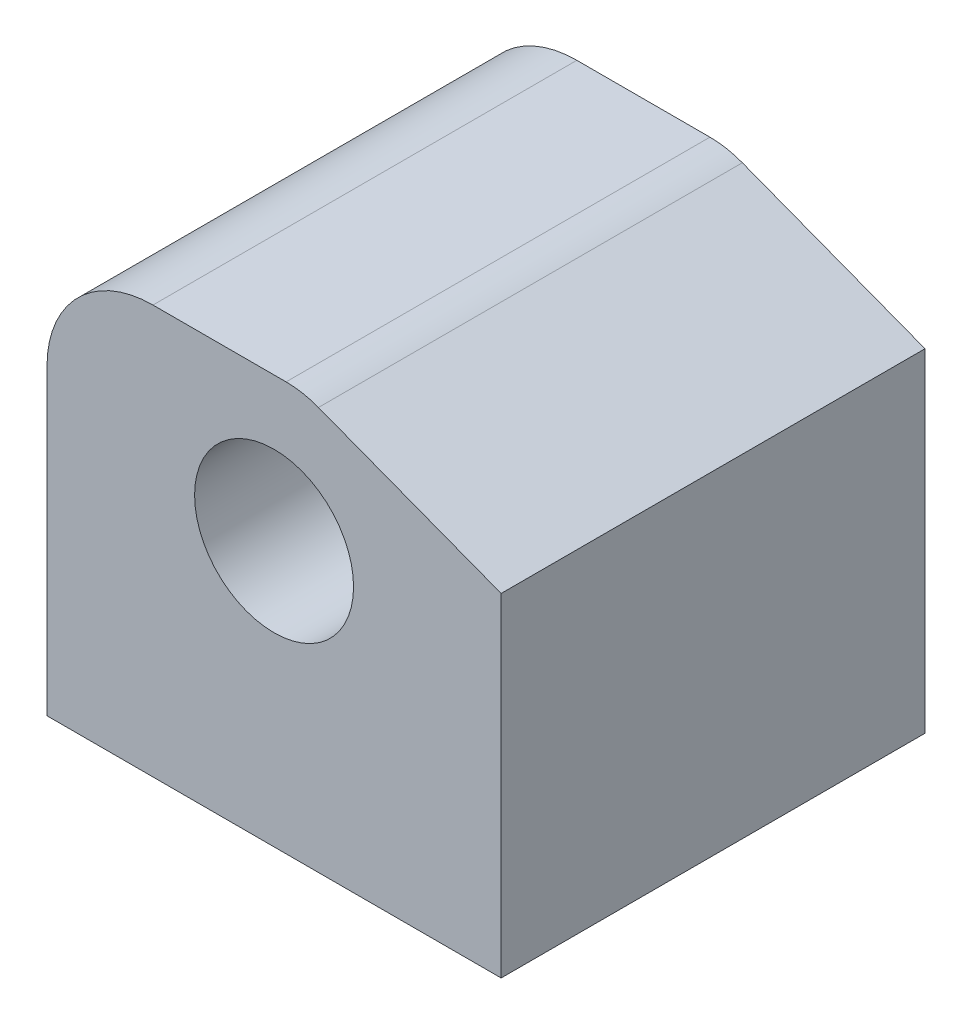
ISO-10303-21;
HEADER;
FILE_DESCRIPTION(('STEP AP214'),'2;1');
FILE_NAME('part.step','',(''),(''),'','','');
FILE_SCHEMA(('AUTOMOTIVE_DESIGN { 1 0 10303 214 1 1 1 1 }'));
ENDSEC;
DATA;
#1=APPLICATION_CONTEXT('core data for automotive mechanical design processes');
#2=APPLICATION_PROTOCOL_DEFINITION('international standard','automotive_design',2000,#1);
#3=PRODUCT_CONTEXT('',#1,'mechanical');
#4=PRODUCT('Part','Part','',(#3));
#5=PRODUCT_RELATED_PRODUCT_CATEGORY('part','',(#4));
#6=PRODUCT_DEFINITION_FORMATION('','',#4);
#7=PRODUCT_DEFINITION_CONTEXT('part definition',#1,'design');
#8=PRODUCT_DEFINITION('design','',#6,#7);
#9=PRODUCT_DEFINITION_SHAPE('','',#8);
#10=(LENGTH_UNIT() NAMED_UNIT(*) SI_UNIT(.MILLI.,.METRE.));
#11=(NAMED_UNIT(*) PLANE_ANGLE_UNIT() SI_UNIT($,.RADIAN.));
#12=(NAMED_UNIT(*) SI_UNIT($,.STERADIAN.) SOLID_ANGLE_UNIT());
#13=UNCERTAINTY_MEASURE_WITH_UNIT(LENGTH_MEASURE(1.E-05),#10,'distance_accuracy_value','');
#14=(GEOMETRIC_REPRESENTATION_CONTEXT(3) GLOBAL_UNCERTAINTY_ASSIGNED_CONTEXT((#13)) GLOBAL_UNIT_ASSIGNED_CONTEXT((#10,
#11,#12)) REPRESENTATION_CONTEXT('',''));
#15=CARTESIAN_POINT('',(0.,0.,0.));
#16=DIRECTION('',(0.,0.,1.));
#17=DIRECTION('',(1.,0.,0.));
#18=AXIS2_PLACEMENT_3D('',#15,#16,#17);
#19=CARTESIAN_POINT('',(0.396938726004659,10.5,0.));
#20=DIRECTION('',(0.,0.,-1.));
#21=DIRECTION('',(-1.,0.,0.));
#22=AXIS2_PLACEMENT_3D('',#19,#20,#21);
#23=CYLINDRICAL_SURFACE('',#22,3.);
#24=DIRECTION('',(0.,0.,-1.));
#25=VECTOR('',#24,1.);
#26=CARTESIAN_POINT('',(0.396938726004659,13.5,0.));
#27=LINE('',#26,#25);
#28=CARTESIAN_POINT('',(0.39693872600466,13.5,7.));
#29=VERTEX_POINT('',#28);
#30=CARTESIAN_POINT('',(0.396938726004657,13.5,-7.));
#31=VERTEX_POINT('',#30);
#32=EDGE_CURVE('E161',#29,#31,#27,.T.);
#33=ORIENTED_EDGE('',*,*,#32,.F.);
#34=CARTESIAN_POINT('',(0.396938726004659,10.5,7.));
#35=DIRECTION('',(0.,0.,-1.));
#36=DIRECTION('',(-1.,0.,0.));
#37=AXIS2_PLACEMENT_3D('',#34,#35,#36);
#38=CIRCLE('',#37,3.);
#39=CARTESIAN_POINT('',(1.4667039050387,13.3027847690692,7.));
#40=VERTEX_POINT('',#39);
#41=EDGE_CURVE('E55',#40,#29,#38,.F.);
#42=ORIENTED_EDGE('',*,*,#41,.F.);
#43=DIRECTION('',(0.,0.,-1.));
#44=VECTOR('',#43,1.);
#45=CARTESIAN_POINT('',(1.4667039050387,13.3027847690692,-8.));
#46=LINE('',#45,#44);
#47=CARTESIAN_POINT('',(1.4667039050387,13.3027847690692,-7.));
#48=VERTEX_POINT('',#47);
#49=EDGE_CURVE('E109',#48,#40,#46,.F.);
#50=ORIENTED_EDGE('',*,*,#49,.F.);
#51=CARTESIAN_POINT('',(0.396938726004659,10.5,-7.));
#52=DIRECTION('',(0.,0.,1.));
#53=DIRECTION('',(1.,0.,0.));
#54=AXIS2_PLACEMENT_3D('',#51,#52,#53);
#55=CIRCLE('',#54,3.);
#56=EDGE_CURVE('E11',#31,#48,#55,.F.);
#57=ORIENTED_EDGE('',*,*,#56,.F.);
#58=EDGE_LOOP('',(#33,#42,#50,#57));
#59=FACE_BOUND('',#58,.T.);
#60=ADVANCED_FACE('F47',(#59),#23,.T.);
#61=CARTESIAN_POINT('',(-4.,10.,0.));
#62=DIRECTION('',(0.,0.,1.));
#63=DIRECTION('',(1.,0.,0.));
#64=AXIS2_PLACEMENT_3D('',#61,#62,#63);
#65=CYLINDRICAL_SURFACE('',#64,3.5);
#66=DIRECTION('',(0.,0.,1.));
#67=VECTOR('',#66,1.);
#68=CARTESIAN_POINT('',(-4.,13.5,0.));
#69=LINE('',#68,#67);
#70=CARTESIAN_POINT('',(-4.,13.5,-7.));
#71=VERTEX_POINT('',#70);
#72=CARTESIAN_POINT('',(-4.,13.5,7.));
#73=VERTEX_POINT('',#72);
#74=EDGE_CURVE('E146',#71,#73,#69,.T.);
#75=ORIENTED_EDGE('',*,*,#74,.F.);
#76=CARTESIAN_POINT('',(-4.,10.,-7.));
#77=DIRECTION('',(0.,0.,1.));
#78=DIRECTION('',(1.,0.,0.));
#79=AXIS2_PLACEMENT_3D('',#76,#77,#78);
#80=CIRCLE('',#79,3.5);
#81=CARTESIAN_POINT('',(-7.5,10.,-7.));
#82=VERTEX_POINT('',#81);
#83=EDGE_CURVE('E154',#82,#71,#80,.F.);
#84=ORIENTED_EDGE('',*,*,#83,.F.);
#85=DIRECTION('',(0.,0.,1.));
#86=VECTOR('',#85,1.);
#87=CARTESIAN_POINT('',(-7.5,10.,7.));
#88=LINE('',#87,#86);
#89=CARTESIAN_POINT('',(-7.5,10.,7.));
#90=VERTEX_POINT('',#89);
#91=EDGE_CURVE('E150',#90,#82,#88,.F.);
#92=ORIENTED_EDGE('',*,*,#91,.F.);
#93=CARTESIAN_POINT('',(-4.,10.,7.));
#94=DIRECTION('',(0.,0.,-1.));
#95=DIRECTION('',(-1.,0.,0.));
#96=AXIS2_PLACEMENT_3D('',#93,#94,#95);
#97=CIRCLE('',#96,3.5);
#98=EDGE_CURVE('E158',#73,#90,#97,.F.);
#99=ORIENTED_EDGE('',*,*,#98,.F.);
#100=EDGE_LOOP('',(#75,#84,#92,#99));
#101=FACE_BOUND('',#100,.T.);
#102=ADVANCED_FACE('F172',(#101),#65,.T.);
#103=CARTESIAN_POINT('',(7.5,13.5,7.));
#104=DIRECTION('',(-1.,0.,0.));
#105=DIRECTION('',(0.,0.,1.));
#106=AXIS2_PLACEMENT_3D('',#103,#104,#105);
#107=PLANE('',#106);
#108=DIRECTION('',(0.,-1.,0.));
#109=VECTOR('',#108,1.);
#110=CARTESIAN_POINT('',(7.5,13.5,-7.));
#111=LINE('',#110,#109);
#112=CARTESIAN_POINT('',(7.5,11.,-7.));
#113=VERTEX_POINT('',#112);
#114=CARTESIAN_POINT('',(7.5,0.,-7.));
#115=VERTEX_POINT('',#114);
#116=EDGE_CURVE('E120',#113,#115,#111,.T.);
#117=ORIENTED_EDGE('',*,*,#116,.F.);
#118=DIRECTION('',(0.,0.,1.));
#119=VECTOR('',#118,1.);
#120=CARTESIAN_POINT('',(7.5,11.,-8.));
#121=LINE('',#120,#119);
#122=CARTESIAN_POINT('',(7.5,11.,7.));
#123=VERTEX_POINT('',#122);
#124=EDGE_CURVE('E107',#113,#123,#121,.T.);
#125=ORIENTED_EDGE('',*,*,#124,.T.);
#126=DIRECTION('',(0.,-1.,0.));
#127=VECTOR('',#126,1.);
#128=CARTESIAN_POINT('',(7.5,13.5,7.));
#129=LINE('',#128,#127);
#130=CARTESIAN_POINT('',(7.5,0.,7.));
#131=VERTEX_POINT('',#130);
#132=EDGE_CURVE('E118',#123,#131,#129,.T.);
#133=ORIENTED_EDGE('',*,*,#132,.T.);
#134=DIRECTION('',(0.,0.,-1.));
#135=VECTOR('',#134,1.);
#136=CARTESIAN_POINT('',(7.5,0.,7.));
#137=LINE('',#136,#135);
#138=EDGE_CURVE('E187',#131,#115,#137,.T.);
#139=ORIENTED_EDGE('',*,*,#138,.T.);
#140=EDGE_LOOP('',(#117,#125,#133,#139));
#141=FACE_BOUND('',#140,.T.);
#142=ADVANCED_FACE('F116',(#141),#107,.F.);
#143=CARTESIAN_POINT('',(-7.5,13.5,-7.));
#144=DIRECTION('',(0.,0.,1.));
#145=DIRECTION('',(1.,0.,0.));
#146=AXIS2_PLACEMENT_3D('',#143,#144,#145);
#147=PLANE('',#146);
#148=CARTESIAN_POINT('',(0.,8.75,-7.));
#149=DIRECTION('',(0.,0.,1.));
#150=DIRECTION('',(1.,0.,0.));
#151=AXIS2_PLACEMENT_3D('',#148,#149,#150);
#152=CIRCLE('',#151,2.625);
#153=CARTESIAN_POINT('',(2.625,8.75,-7.));
#154=VERTEX_POINT('',#153);
#155=EDGE_CURVE('E192',#154,#154,#152,.T.);
#156=ORIENTED_EDGE('',*,*,#155,.T.);
#157=EDGE_LOOP('',(#156));
#158=FACE_BOUND('',#157,.T.);
#159=DIRECTION('',(-1.,0.,0.));
#160=VECTOR('',#159,1.);
#161=CARTESIAN_POINT('',(-7.5,13.5,-7.));
#162=LINE('',#161,#160);
#163=EDGE_CURVE('E137',#31,#71,#162,.T.);
#164=ORIENTED_EDGE('',*,*,#163,.F.);
#165=ORIENTED_EDGE('',*,*,#56,.T.);
#166=DIRECTION('',(0.934261589689732,-0.356588393011348,0.));
#167=VECTOR('',#166,1.);
#168=CARTESIAN_POINT('',(-6.42553786684299,16.3150907888714,-7.));
#169=LINE('',#168,#167);
#170=EDGE_CURVE('E122',#48,#113,#169,.T.);
#171=ORIENTED_EDGE('',*,*,#170,.T.);
#172=ORIENTED_EDGE('',*,*,#116,.T.);
#173=DIRECTION('',(-1.,0.,0.));
#174=VECTOR('',#173,1.);
#175=CARTESIAN_POINT('',(-7.5,0.,-7.));
#176=LINE('',#175,#174);
#177=CARTESIAN_POINT('',(-7.5,0.,-7.));
#178=VERTEX_POINT('',#177);
#179=EDGE_CURVE('E185',#115,#178,#176,.T.);
#180=ORIENTED_EDGE('',*,*,#179,.T.);
#181=DIRECTION('',(0.,-1.,0.));
#182=VECTOR('',#181,1.);
#183=CARTESIAN_POINT('',(-7.5,13.5,-7.));
#184=LINE('',#183,#182);
#185=EDGE_CURVE('E134',#82,#178,#184,.T.);
#186=ORIENTED_EDGE('',*,*,#185,.F.);
#187=ORIENTED_EDGE('',*,*,#83,.T.);
#188=EDGE_LOOP('',(#164,#165,#171,#172,#180,#186,#187));
#189=FACE_BOUND('',#188,.T.);
#190=ADVANCED_FACE('F198',(#158,#189),#147,.F.);
#191=CARTESIAN_POINT('',(-7.5,13.5,7.));
#192=DIRECTION('',(1.,0.,0.));
#193=DIRECTION('',(0.,0.,-1.));
#194=AXIS2_PLACEMENT_3D('',#191,#192,#193);
#195=PLANE('',#194);
#196=DIRECTION('',(0.,-1.,0.));
#197=VECTOR('',#196,1.);
#198=CARTESIAN_POINT('',(-7.5,13.5,7.));
#199=LINE('',#198,#197);
#200=CARTESIAN_POINT('',(-7.5,0.,7.));
#201=VERTEX_POINT('',#200);
#202=EDGE_CURVE('E129',#90,#201,#199,.T.);
#203=ORIENTED_EDGE('',*,*,#202,.F.);
#204=ORIENTED_EDGE('',*,*,#91,.T.);
#205=ORIENTED_EDGE('',*,*,#185,.T.);
#206=DIRECTION('',(0.,0.,1.));
#207=VECTOR('',#206,1.);
#208=CARTESIAN_POINT('',(-7.5,0.,7.));
#209=LINE('',#208,#207);
#210=EDGE_CURVE('E178',#178,#201,#209,.T.);
#211=ORIENTED_EDGE('',*,*,#210,.T.);
#212=EDGE_LOOP('',(#203,#204,#205,#211));
#213=FACE_BOUND('',#212,.T.);
#214=ADVANCED_FACE('F179',(#213),#195,.F.);
#215=CARTESIAN_POINT('',(-7.5,13.5,7.));
#216=DIRECTION('',(0.,0.,-1.));
#217=DIRECTION('',(-1.,0.,0.));
#218=AXIS2_PLACEMENT_3D('',#215,#216,#217);
#219=PLANE('',#218);
#220=CARTESIAN_POINT('',(0.,8.75,7.));
#221=DIRECTION('',(0.,0.,1.));
#222=DIRECTION('',(1.,0.,0.));
#223=AXIS2_PLACEMENT_3D('',#220,#221,#222);
#224=CIRCLE('',#223,2.625);
#225=CARTESIAN_POINT('',(2.625,8.75,7.));
#226=VERTEX_POINT('',#225);
#227=EDGE_CURVE('E200',#226,#226,#224,.T.);
#228=ORIENTED_EDGE('',*,*,#227,.F.);
#229=EDGE_LOOP('',(#228));
#230=FACE_BOUND('',#229,.T.);
#231=DIRECTION('',(0.934261589689732,-0.356588393011348,0.));
#232=VECTOR('',#231,1.);
#233=CARTESIAN_POINT('',(0.949999999999999,13.5,7.));
#234=LINE('',#233,#232);
#235=EDGE_CURVE('E103',#40,#123,#234,.T.);
#236=ORIENTED_EDGE('',*,*,#235,.F.);
#237=ORIENTED_EDGE('',*,*,#41,.T.);
#238=DIRECTION('',(1.,0.,0.));
#239=VECTOR('',#238,1.);
#240=CARTESIAN_POINT('',(-7.5,13.5,7.));
#241=LINE('',#240,#239);
#242=EDGE_CURVE('E130',#73,#29,#241,.T.);
#243=ORIENTED_EDGE('',*,*,#242,.F.);
#244=ORIENTED_EDGE('',*,*,#98,.T.);
#245=ORIENTED_EDGE('',*,*,#202,.T.);
#246=DIRECTION('',(1.,0.,0.));
#247=VECTOR('',#246,1.);
#248=CARTESIAN_POINT('',(-7.5,0.,7.));
#249=LINE('',#248,#247);
#250=EDGE_CURVE('E126',#201,#131,#249,.T.);
#251=ORIENTED_EDGE('',*,*,#250,.T.);
#252=ORIENTED_EDGE('',*,*,#132,.F.);
#253=EDGE_LOOP('',(#236,#237,#243,#244,#245,#251,#252));
#254=FACE_BOUND('',#253,.T.);
#255=ADVANCED_FACE('F124',(#230,#254),#219,.F.);
#256=CARTESIAN_POINT('',(0.,13.5,0.));
#257=DIRECTION('',(0.,-1.,0.));
#258=DIRECTION('',(0.,0.,-1.));
#259=AXIS2_PLACEMENT_3D('',#256,#257,#258);
#260=PLANE('',#259);
#261=ORIENTED_EDGE('',*,*,#242,.T.);
#262=ORIENTED_EDGE('',*,*,#32,.T.);
#263=ORIENTED_EDGE('',*,*,#163,.T.);
#264=ORIENTED_EDGE('',*,*,#74,.T.);
#265=EDGE_LOOP('',(#261,#262,#263,#264));
#266=FACE_BOUND('',#265,.T.);
#267=ADVANCED_FACE('F169',(#266),#260,.F.);
#268=CARTESIAN_POINT('',(0.,0.,0.));
#269=DIRECTION('',(0.,-1.,0.));
#270=DIRECTION('',(0.,0.,-1.));
#271=AXIS2_PLACEMENT_3D('',#268,#269,#270);
#272=PLANE('',#271);
#273=CARTESIAN_POINT('',(0.,0.,0.));
#274=DIRECTION('',(0.,-1.,0.));
#275=DIRECTION('',(0.,0.,-1.));
#276=AXIS2_PLACEMENT_3D('',#273,#274,#275);
#277=CIRCLE('',#276,5.5);
#278=CARTESIAN_POINT('',(0.,0.,-5.5));
#279=VERTEX_POINT('',#278);
#280=EDGE_CURVE('E205',#279,#279,#277,.T.);
#281=ORIENTED_EDGE('',*,*,#280,.F.);
#282=EDGE_LOOP('',(#281));
#283=FACE_BOUND('',#282,.T.);
#284=ORIENTED_EDGE('',*,*,#138,.F.);
#285=ORIENTED_EDGE('',*,*,#250,.F.);
#286=ORIENTED_EDGE('',*,*,#210,.F.);
#287=ORIENTED_EDGE('',*,*,#179,.F.);
#288=EDGE_LOOP('',(#284,#285,#286,#287));
#289=FACE_BOUND('',#288,.T.);
#290=ADVANCED_FACE('F186',(#283,#289),#272,.T.);
#291=CARTESIAN_POINT('',(0.,8.75,-8.));
#292=DIRECTION('',(0.,0.,1.));
#293=DIRECTION('',(1.,0.,0.));
#294=AXIS2_PLACEMENT_3D('',#291,#292,#293);
#295=CYLINDRICAL_SURFACE('',#294,2.625);
#296=ORIENTED_EDGE('',*,*,#227,.T.);
#297=EDGE_LOOP('',(#296));
#298=FACE_BOUND('',#297,.T.);
#299=ORIENTED_EDGE('',*,*,#155,.F.);
#300=EDGE_LOOP('',(#299));
#301=FACE_BOUND('',#300,.T.);
#302=ADVANCED_FACE('F222',(#298,#301),#295,.F.);
#303=CARTESIAN_POINT('',(0.949999999999999,13.5,-8.));
#304=DIRECTION('',(-0.356588393011348,-0.934261589689732,0.));
#305=DIRECTION('',(0.934261589689732,-0.356588393011348,0.));
#306=AXIS2_PLACEMENT_3D('',#303,#304,#305);
#307=PLANE('',#306);
#308=ORIENTED_EDGE('',*,*,#170,.F.);
#309=ORIENTED_EDGE('',*,*,#49,.T.);
#310=ORIENTED_EDGE('',*,*,#235,.T.);
#311=ORIENTED_EDGE('',*,*,#124,.F.);
#312=EDGE_LOOP('',(#308,#309,#310,#311));
#313=FACE_BOUND('',#312,.T.);
#314=ADVANCED_FACE('F106',(#313),#307,.F.);
#315=CARTESIAN_POINT('',(0.,3.,0.));
#316=DIRECTION('',(0.,-1.,0.));
#317=DIRECTION('',(0.,0.,-1.));
#318=AXIS2_PLACEMENT_3D('',#315,#316,#317);
#319=CYLINDRICAL_SURFACE('',#318,5.5);
#320=CARTESIAN_POINT('',(0.,3.,0.));
#321=DIRECTION('',(0.,-1.,0.));
#322=DIRECTION('',(0.,0.,-1.));
#323=AXIS2_PLACEMENT_3D('',#320,#321,#322);
#324=CIRCLE('',#323,5.5);
#325=CARTESIAN_POINT('',(0.,3.,-5.5));
#326=VERTEX_POINT('',#325);
#327=EDGE_CURVE('E113',#326,#326,#324,.T.);
#328=ORIENTED_EDGE('',*,*,#327,.F.);
#329=EDGE_LOOP('',(#328));
#330=FACE_BOUND('',#329,.T.);
#331=ORIENTED_EDGE('',*,*,#280,.T.);
#332=EDGE_LOOP('',(#331));
#333=FACE_BOUND('',#332,.T.);
#334=ADVANCED_FACE('F215',(#330,#333),#319,.F.);
#335=CARTESIAN_POINT('',(0.,3.,0.));
#336=DIRECTION('',(0.,-1.,0.));
#337=DIRECTION('',(0.,0.,-1.));
#338=AXIS2_PLACEMENT_3D('',#335,#336,#337);
#339=PLANE('',#338);
#340=ORIENTED_EDGE('',*,*,#327,.T.);
#341=EDGE_LOOP('',(#340));
#342=FACE_BOUND('',#341,.T.);
#343=ADVANCED_FACE('F213',(#342),#339,.T.);
#344=CLOSED_SHELL('',(#60,#102,#142,#190,#214,#255,#267,#290,#302,#314,#334,#343));
#345=MANIFOLD_SOLID_BREP('B2',#344);
#346=ADVANCED_BREP_SHAPE_REPRESENTATION('',(#18,#345),#14);
#347=SHAPE_DEFINITION_REPRESENTATION(#9,#346);
ENDSEC;
END-ISO-10303-21;
